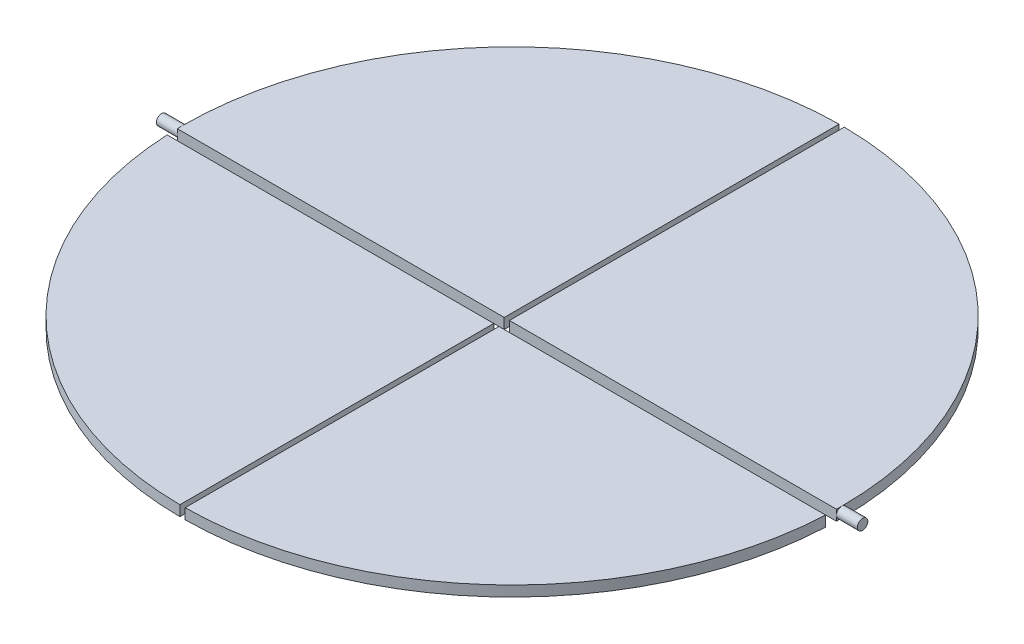
ISO-10303-21;
HEADER;
FILE_DESCRIPTION(('STEP AP214'),'2;1');
FILE_NAME('part.step','',(''),(''),'','','');
FILE_SCHEMA(('AUTOMOTIVE_DESIGN { 1 0 10303 214 1 1 1 1 }'));
ENDSEC;
DATA;
#1=APPLICATION_CONTEXT('core data for automotive mechanical design processes');
#2=APPLICATION_PROTOCOL_DEFINITION('international standard','automotive_design',2000,#1);
#3=PRODUCT_CONTEXT('',#1,'mechanical');
#4=PRODUCT('Part','Part','',(#3));
#5=PRODUCT_RELATED_PRODUCT_CATEGORY('part','',(#4));
#6=PRODUCT_DEFINITION_FORMATION('','',#4);
#7=PRODUCT_DEFINITION_CONTEXT('part definition',#1,'design');
#8=PRODUCT_DEFINITION('design','',#6,#7);
#9=PRODUCT_DEFINITION_SHAPE('','',#8);
#10=(LENGTH_UNIT() NAMED_UNIT(*) SI_UNIT(.MILLI.,.METRE.));
#11=(NAMED_UNIT(*) PLANE_ANGLE_UNIT() SI_UNIT($,.RADIAN.));
#12=(NAMED_UNIT(*) SI_UNIT($,.STERADIAN.) SOLID_ANGLE_UNIT());
#13=UNCERTAINTY_MEASURE_WITH_UNIT(LENGTH_MEASURE(1.E-05),#10,'distance_accuracy_value','');
#14=(GEOMETRIC_REPRESENTATION_CONTEXT(3) GLOBAL_UNCERTAINTY_ASSIGNED_CONTEXT((#13)) GLOBAL_UNIT_ASSIGNED_CONTEXT((#10,
#11,#12)) REPRESENTATION_CONTEXT('',''));
#15=CARTESIAN_POINT('',(0.,0.,0.));
#16=DIRECTION('',(0.,0.,1.));
#17=DIRECTION('',(1.,0.,0.));
#18=AXIS2_PLACEMENT_3D('',#15,#16,#17);
#19=CARTESIAN_POINT('',(0.,0.,0.));
#20=DIRECTION('',(0.,1.,0.));
#21=DIRECTION('',(0.,0.,1.));
#22=AXIS2_PLACEMENT_3D('',#19,#20,#21);
#23=PLANE('',#22);
#24=CARTESIAN_POINT('',(0.,0.,0.));
#25=DIRECTION('',(0.,1.,0.));
#26=DIRECTION('',(0.,0.,1.));
#27=AXIS2_PLACEMENT_3D('',#24,#25,#26);
#28=CIRCLE('',#27,63.);
#29=CARTESIAN_POINT('',(0.500000000000007,0.,62.9980158417708));
#30=VERTEX_POINT('',#29);
#31=CARTESIAN_POINT('',(62.9285308902091,0.,2.99999999999999));
#32=VERTEX_POINT('',#31);
#33=EDGE_CURVE('E105',#30,#32,#28,.T.);
#34=ORIENTED_EDGE('',*,*,#33,.F.);
#35=DIRECTION('',(0.,0.,-1.));
#36=VECTOR('',#35,1.);
#37=CARTESIAN_POINT('',(0.500000000000009,0.,76.0886307398835));
#38=LINE('',#37,#36);
#39=CARTESIAN_POINT('',(0.5,0.,2.99999999999999));
#40=VERTEX_POINT('',#39);
#41=EDGE_CURVE('E75',#30,#40,#38,.T.);
#42=ORIENTED_EDGE('',*,*,#41,.T.);
#43=DIRECTION('',(1.,0.,0.));
#44=VECTOR('',#43,1.);
#45=CARTESIAN_POINT('',(0.,0.,2.99999999999999));
#46=LINE('',#45,#44);
#47=EDGE_CURVE('E98',#40,#32,#46,.T.);
#48=ORIENTED_EDGE('',*,*,#47,.T.);
#49=EDGE_LOOP('',(#34,#42,#48));
#50=FACE_BOUND('',#49,.T.);
#51=ADVANCED_FACE('F56',(#50),#23,.F.);
#52=CARTESIAN_POINT('',(0.,2.,0.));
#53=DIRECTION('',(0.,1.,0.));
#54=DIRECTION('',(0.,0.,1.));
#55=AXIS2_PLACEMENT_3D('',#52,#53,#54);
#56=PLANE('',#55);
#57=DIRECTION('',(0.,0.,-1.));
#58=VECTOR('',#57,1.);
#59=CARTESIAN_POINT('',(0.500000000000009,2.,76.0886307398835));
#60=LINE('',#59,#58);
#61=CARTESIAN_POINT('',(0.500000000000007,2.,62.9980158417708));
#62=VERTEX_POINT('',#61);
#63=CARTESIAN_POINT('',(0.500000000000009,2.,2.99999999999999));
#64=VERTEX_POINT('',#63);
#65=EDGE_CURVE('E12',#62,#64,#60,.T.);
#66=ORIENTED_EDGE('',*,*,#65,.F.);
#67=CARTESIAN_POINT('',(0.,2.,0.));
#68=DIRECTION('',(0.,1.,0.));
#69=DIRECTION('',(0.,0.,1.));
#70=AXIS2_PLACEMENT_3D('',#67,#68,#69);
#71=CIRCLE('',#70,63.);
#72=CARTESIAN_POINT('',(62.9285308902091,2.,2.99999999999999));
#73=VERTEX_POINT('',#72);
#74=EDGE_CURVE('E102',#62,#73,#71,.T.);
#75=ORIENTED_EDGE('',*,*,#74,.T.);
#76=DIRECTION('',(1.,0.,0.));
#77=VECTOR('',#76,1.);
#78=CARTESIAN_POINT('',(0.,2.,2.99999999999999));
#79=LINE('',#78,#77);
#80=EDGE_CURVE('E59',#64,#73,#79,.T.);
#81=ORIENTED_EDGE('',*,*,#80,.F.);
#82=EDGE_LOOP('',(#66,#75,#81));
#83=FACE_BOUND('',#82,.T.);
#84=ADVANCED_FACE('F101',(#83),#56,.T.);
#85=CARTESIAN_POINT('',(0.,2.,0.));
#86=DIRECTION('',(0.,-1.,0.));
#87=DIRECTION('',(0.,0.,-1.));
#88=AXIS2_PLACEMENT_3D('',#85,#86,#87);
#89=CYLINDRICAL_SURFACE('',#88,63.);
#90=ORIENTED_EDGE('',*,*,#74,.F.);
#91=DIRECTION('',(0.,-1.,0.));
#92=VECTOR('',#91,1.);
#93=CARTESIAN_POINT('',(0.500000000000007,2.,62.9980158417708));
#94=LINE('',#93,#92);
#95=EDGE_CURVE('E70',#62,#30,#94,.T.);
#96=ORIENTED_EDGE('',*,*,#95,.T.);
#97=ORIENTED_EDGE('',*,*,#33,.T.);
#98=DIRECTION('',(0.,1.,0.));
#99=VECTOR('',#98,1.);
#100=CARTESIAN_POINT('',(62.9285308902091,0.,2.99999999999999));
#101=LINE('',#100,#99);
#102=EDGE_CURVE('E99',#32,#73,#101,.T.);
#103=ORIENTED_EDGE('',*,*,#102,.T.);
#104=EDGE_LOOP('',(#90,#96,#97,#103));
#105=FACE_BOUND('',#104,.T.);
#106=ADVANCED_FACE('F111',(#105),#89,.T.);
#107=CARTESIAN_POINT('',(0.,0.,2.99999999999999));
#108=DIRECTION('',(0.,0.,1.));
#109=DIRECTION('',(1.,0.,0.));
#110=AXIS2_PLACEMENT_3D('',#107,#108,#109);
#111=PLANE('',#110);
#112=ORIENTED_EDGE('',*,*,#47,.F.);
#113=DIRECTION('',(0.,1.,0.));
#114=VECTOR('',#113,1.);
#115=CARTESIAN_POINT('',(0.5,0.,2.99999999999999));
#116=LINE('',#115,#114);
#117=EDGE_CURVE('E87',#40,#64,#116,.T.);
#118=ORIENTED_EDGE('',*,*,#117,.T.);
#119=ORIENTED_EDGE('',*,*,#80,.T.);
#120=ORIENTED_EDGE('',*,*,#102,.F.);
#121=EDGE_LOOP('',(#112,#118,#119,#120));
#122=FACE_BOUND('',#121,.T.);
#123=ADVANCED_FACE('F94',(#122),#111,.F.);
#124=CARTESIAN_POINT('',(0.500000000000009,0.,76.0886307398835));
#125=DIRECTION('',(1.,0.,0.));
#126=DIRECTION('',(0.,0.,-1.));
#127=AXIS2_PLACEMENT_3D('',#124,#125,#126);
#128=PLANE('',#127);
#129=ORIENTED_EDGE('',*,*,#65,.T.);
#130=ORIENTED_EDGE('',*,*,#117,.F.);
#131=ORIENTED_EDGE('',*,*,#41,.F.);
#132=ORIENTED_EDGE('',*,*,#95,.F.);
#133=EDGE_LOOP('',(#129,#130,#131,#132));
#134=FACE_BOUND('',#133,.T.);
#135=ADVANCED_FACE('F86',(#134),#128,.F.);
#136=CLOSED_SHELL('',(#51,#84,#106,#123,#135));
#137=MANIFOLD_SOLID_BREP('B2',#136);
#138=CARTESIAN_POINT('',(0.,2.,0.));
#139=DIRECTION('',(0.,-1.,0.));
#140=DIRECTION('',(0.,0.,-1.));
#141=AXIS2_PLACEMENT_3D('',#138,#139,#140);
#142=CYLINDRICAL_SURFACE('',#141,63.);
#143=CARTESIAN_POINT('',(0.,0.,0.));
#144=DIRECTION('',(0.,1.,0.));
#145=DIRECTION('',(0.,0.,1.));
#146=AXIS2_PLACEMENT_3D('',#143,#144,#145);
#147=CIRCLE('',#146,63.);
#148=CARTESIAN_POINT('',(63.,0.,0.));
#149=VERTEX_POINT('',#148);
#150=CARTESIAN_POINT('',(0.5,0.,-62.9980158417707));
#151=VERTEX_POINT('',#150);
#152=EDGE_CURVE('E168',#149,#151,#147,.T.);
#153=ORIENTED_EDGE('',*,*,#152,.T.);
#154=DIRECTION('',(0.,-1.,0.));
#155=VECTOR('',#154,1.);
#156=CARTESIAN_POINT('',(0.5,2.,-62.9980158417708));
#157=LINE('',#156,#155);
#158=CARTESIAN_POINT('',(0.5,2.,-62.9980158417707));
#159=VERTEX_POINT('',#158);
#160=EDGE_CURVE('E183',#151,#159,#157,.F.);
#161=ORIENTED_EDGE('',*,*,#160,.T.);
#162=CARTESIAN_POINT('',(0.,2.,0.));
#163=DIRECTION('',(0.,1.,0.));
#164=DIRECTION('',(0.,0.,1.));
#165=AXIS2_PLACEMENT_3D('',#162,#163,#164);
#166=CIRCLE('',#165,63.);
#167=CARTESIAN_POINT('',(63.,2.,0.));
#168=VERTEX_POINT('',#167);
#169=EDGE_CURVE('E220',#168,#159,#166,.T.);
#170=ORIENTED_EDGE('',*,*,#169,.F.);
#171=CARTESIAN_POINT('',(63.,2.,0.));
#172=CARTESIAN_POINT('',(62.9999998927801,1.99999751044008,-0.0561666432225347));
#173=CARTESIAN_POINT('',(62.9999240819839,1.99525208264565,-0.112373922502886));
#174=CARTESIAN_POINT('',(62.999628945612,1.97638762701122,-0.22324024292529));
#175=CARTESIAN_POINT('',(62.9994094476661,1.96225734060228,-0.277897342171853));
#176=CARTESIAN_POINT('',(62.9988518002486,1.92502575940682,-0.384041100981931));
#177=CARTESIAN_POINT('',(62.9985137078414,1.90192877858822,-0.435529271369662));
#178=CARTESIAN_POINT('',(62.9977570314289,1.84742544657334,-0.533882815848443));
#179=CARTESIAN_POINT('',(62.9973384673431,1.81602115099488,-0.580749329620264));
#180=CARTESIAN_POINT('',(62.9964678868612,1.74578537332572,-0.668554628843129));
#181=CARTESIAN_POINT('',(62.9960158643467,1.70695253072046,-0.709492326033491));
#182=CARTESIAN_POINT('',(62.9951293686052,1.62296367209696,-0.784268998105302));
#183=CARTESIAN_POINT('',(62.9946948960708,1.57780740690147,-0.81810769311612));
#184=CARTESIAN_POINT('',(62.9938924898058,1.48245269722975,-0.877724996623669));
#185=CARTESIAN_POINT('',(62.9935245583476,1.43225408064874,-0.903503329881728));
#186=CARTESIAN_POINT('',(62.9928967443497,1.32824092731131,-0.946266207889913));
#187=CARTESIAN_POINT('',(62.9926368615323,1.27442639984849,-0.963250775240731));
#188=CARTESIAN_POINT('',(62.9922544709765,1.16471374219309,-0.987942689198417));
#189=CARTESIAN_POINT('',(62.9921319517658,1.10881578640643,-0.995650810555873));
#190=CARTESIAN_POINT('',(62.9920380675559,0.99651916667162,-1.00157340010755));
#191=CARTESIAN_POINT('',(62.9920667021917,0.9401205039329,-0.999787891227032));
#192=CARTESIAN_POINT('',(62.9922718858726,0.828428698091347,-0.986774599142015));
#193=CARTESIAN_POINT('',(62.9924484216319,0.773135456145996,-0.975547664054824));
#194=CARTESIAN_POINT('',(62.9929294843787,0.665218644820116,-0.943971516390759));
#195=CARTESIAN_POINT('',(62.9932340115425,0.612595079115556,-0.923622291253469));
#196=CARTESIAN_POINT('',(62.9939367404442,0.511508756651117,-0.874378239749819));
#197=CARTESIAN_POINT('',(62.9943349464438,0.463046189321602,-0.845483024591268));
#198=CARTESIAN_POINT('',(62.9951801350739,0.371659653486664,-0.779967536703924));
#199=CARTESIAN_POINT('',(62.9956271177213,0.328735686911454,-0.743347261282944));
#200=CARTESIAN_POINT('',(62.9965195268522,0.249639851923911,-0.663416361880623));
#201=CARTESIAN_POINT('',(62.9969649531583,0.213468729796305,-0.62010499940508));
#202=CARTESIAN_POINT('',(62.9978039850519,0.148911109301982,-0.528024004064598));
#203=CARTESIAN_POINT('',(62.9981975906323,0.120524612012234,-0.479254370444533));
#204=CARTESIAN_POINT('',(62.9988886081472,0.0723421381491057,-0.377640849128776));
#205=CARTESIAN_POINT('',(62.9991860198336,0.052546183729908,-0.324796950926362));
#206=CARTESIAN_POINT('',(62.9996511158661,0.0221072115742371,-0.216535157659641));
#207=CARTESIAN_POINT('',(62.9998188003152,0.0114641865677128,-0.161117264639862));
#208=CARTESIAN_POINT('',(63.0000055249692,-0.000365894132838789,-0.0492871024294313));
#209=CARTESIAN_POINT('',(63.0000245813948,-0.00155398170724248,0.00712505757673893));
#210=CARTESIAN_POINT('',(62.9999119445625,0.00555685114072476,0.119348080955619));
#211=CARTESIAN_POINT('',(62.9997802513486,0.0138557687961803,0.175158944503695));
#212=CARTESIAN_POINT('',(62.9993809715643,0.0397041787547584,0.284592208001385));
#213=CARTESIAN_POINT('',(62.999113391857,0.0572532038804057,0.33821471832662));
#214=CARTESIAN_POINT('',(62.9984725023587,0.101103190659322,0.44175248000115));
#215=CARTESIAN_POINT('',(62.9980991925181,0.127404156427928,0.491667729607203));
#216=CARTESIAN_POINT('',(62.997288880645,0.188014083501718,0.58637878778528));
#217=CARTESIAN_POINT('',(62.9968518730875,0.222323739632951,0.631174151658477));
#218=CARTESIAN_POINT('',(62.995963448209,0.297976093393741,0.714369387532707));
#219=CARTESIAN_POINT('',(62.9955120308736,0.339318798093904,0.752769253104013));
#220=CARTESIAN_POINT('',(62.9946456331274,0.42786807771191,0.822086867574606));
#221=CARTESIAN_POINT('',(62.9942306559657,0.475075174603494,0.853003949728408));
#222=CARTESIAN_POINT('',(62.9934839757407,0.574010467206131,0.906473780561848));
#223=CARTESIAN_POINT('',(62.9931522725616,0.625738656624403,0.929026540883322));
#224=CARTESIAN_POINT('',(62.9926095606234,0.732245231245425,0.965126386356914));
#225=CARTESIAN_POINT('',(62.9923985460315,0.787023468900533,0.978673906732622));
#226=CARTESIAN_POINT('',(62.9921209851839,0.898077330864654,0.996380141563631));
#227=CARTESIAN_POINT('',(62.9920544390802,0.954352956749301,1.0005388461391));
#228=CARTESIAN_POINT('',(62.9920733204648,1.06679730027058,0.999349317400655));
#229=CARTESIAN_POINT('',(62.992158730975,1.1229660291488,0.994002146168894));
#230=CARTESIAN_POINT('',(62.9924718610481,1.23360851341797,0.973954813622973));
#231=CARTESIAN_POINT('',(62.9926995808961,1.28808226541207,0.959254633565973));
#232=CARTESIAN_POINT('',(62.993271658362,1.39378949618629,0.920918470362608));
#233=CARTESIAN_POINT('',(62.9936160181177,1.44502291555617,0.897282323434151));
#234=CARTESIAN_POINT('',(62.9943825356015,1.54279263722827,0.841746265659636));
#235=CARTESIAN_POINT('',(62.9948046903424,1.58932911978353,0.809846672105262));
#236=CARTESIAN_POINT('',(62.9956792265095,1.67638712114475,0.738688893341088));
#237=CARTESIAN_POINT('',(62.9961316080961,1.7169086080276,0.699430669079672));
#238=CARTESIAN_POINT('',(62.9970157191694,1.79079608183503,0.614657063190975));
#239=CARTESIAN_POINT('',(62.9974474435007,1.82416028965812,0.569140130425279));
#240=CARTESIAN_POINT('',(62.9982416571192,1.88278784761654,0.473130496152272));
#241=CARTESIAN_POINT('',(62.9986041099354,1.90804693517234,0.422635194649554));
#242=CARTESIAN_POINT('',(62.9992181858523,1.94969988986234,0.318159477863941));
#243=CARTESIAN_POINT('',(62.9994699415537,1.96610436904772,0.264183321592263));
#244=CARTESIAN_POINT('',(62.9997666899057,1.98521722752854,0.174886679296475));
#245=CARTESIAN_POINT('',(62.999853803534,1.99075383288731,0.140146252669038));
#246=CARTESIAN_POINT('',(62.9999704921249,1.99814599788615,0.0702758544141254));
#247=CARTESIAN_POINT('',(63.0000000670921,2.00000155782465,0.0351458828182307));
#248=CARTESIAN_POINT('',(63.,2.,0.));
#249=B_SPLINE_CURVE_WITH_KNOTS('',3,(#171,#172,#173,#174,#175,#176,#177,#178,#179,#180,#181,
#182,#183,#184,#185,#186,#187,#188,#189,#190,#191,#192,#193,#194,#195,#196,#197,#198,#199,#200,
#201,#202,#203,#204,#205,#206,#207,#208,#209,#210,#211,#212,#213,#214,#215,#216,#217,#218,#219,
#220,#221,#222,#223,#224,#225,#226,#227,#228,#229,#230,#231,#232,#233,#234,#235,#236,#237,#238,
#239,#240,#241,#242,#243,#244,#245,#246,#247,#248),.UNSPECIFIED.,.T.,.F.,(4,2,2,2,2,2,2,2,2,2,2,
2,2,2,2,2,2,2,2,2,2,2,2,2,2,2,2,2,2,2,2,2,2,2,2,2,2,2,4),(0.,0.168371645991673,
0.336945645169948,0.505438641990063,0.673889984707769,0.84237220833707,1.01086107295162,
1.1793556903586,1.34784987471857,1.51632998579769,1.68480969003047,1.85327426145504,
2.02173906483797,2.19021153355603,2.35868406098691,2.52717519600528,2.69566635433365,
2.86415794718192,3.03264940619942,3.20112247636811,3.36959549740112,3.53806001050483,
3.70652460282403,3.8750038164005,4.04348319935687,4.21197758896782,4.38047174405992,
4.5489577552309,4.71744394369924,4.8859113085545,5.0543790110088,5.22284980135843,
5.39131412389121,5.55977934047492,5.72828638445005,5.89688190359658,6.06527491357461,
6.17063229796083,6.27598967380564),.UNSPECIFIED.);
#250=EDGE_CURVE('E234',#168,#149,#249,.T.);
#251=ORIENTED_EDGE('',*,*,#250,.T.);
#252=EDGE_LOOP('',(#153,#161,#170,#251));
#253=FACE_BOUND('',#252,.T.);
#254=ADVANCED_FACE('F164',(#253),#142,.T.);
#255=CARTESIAN_POINT('',(0.,2.,0.));
#256=DIRECTION('',(0.,1.,0.));
#257=DIRECTION('',(0.,0.,1.));
#258=AXIS2_PLACEMENT_3D('',#255,#256,#257);
#259=PLANE('',#258);
#260=DIRECTION('',(0.,0.,-1.));
#261=VECTOR('',#260,1.);
#262=CARTESIAN_POINT('',(0.5,2.,2.02511387558862));
#263=LINE('',#262,#261);
#264=CARTESIAN_POINT('',(0.5,2.,0.999999999999994));
#265=VERTEX_POINT('',#264);
#266=EDGE_CURVE('E54',#265,#159,#263,.T.);
#267=ORIENTED_EDGE('',*,*,#266,.F.);
#268=DIRECTION('',(-1.,0.,0.));
#269=VECTOR('',#268,1.);
#270=CARTESIAN_POINT('',(0.,2.,0.999999999999993));
#271=LINE('',#270,#269);
#272=CARTESIAN_POINT('',(62.9920629920945,2.,0.999999999999993));
#273=VERTEX_POINT('',#272);
#274=EDGE_CURVE('E213',#273,#265,#271,.T.);
#275=ORIENTED_EDGE('',*,*,#274,.F.);
#276=EDGE_CURVE('E232',#273,#168,#166,.T.);
#277=ORIENTED_EDGE('',*,*,#276,.T.);
#278=ORIENTED_EDGE('',*,*,#169,.T.);
#279=EDGE_LOOP('',(#267,#275,#277,#278));
#280=FACE_BOUND('',#279,.T.);
#281=ADVANCED_FACE('F166',(#280),#259,.T.);
#282=CARTESIAN_POINT('',(0.,0.,0.));
#283=DIRECTION('',(0.,1.,0.));
#284=DIRECTION('',(0.,0.,1.));
#285=AXIS2_PLACEMENT_3D('',#282,#283,#284);
#286=PLANE('',#285);
#287=DIRECTION('',(-1.,0.,0.));
#288=VECTOR('',#287,1.);
#289=CARTESIAN_POINT('',(0.,0.,0.999999999999993));
#290=LINE('',#289,#288);
#291=CARTESIAN_POINT('',(62.9920629920945,0.,0.999999999999993));
#292=VERTEX_POINT('',#291);
#293=CARTESIAN_POINT('',(0.5,0.,0.999999999999993));
#294=VERTEX_POINT('',#293);
#295=EDGE_CURVE('E227',#292,#294,#290,.T.);
#296=ORIENTED_EDGE('',*,*,#295,.T.);
#297=DIRECTION('',(0.,0.,-1.));
#298=VECTOR('',#297,1.);
#299=CARTESIAN_POINT('',(0.5,0.,2.02511387558862));
#300=LINE('',#299,#298);
#301=EDGE_CURVE('E203',#294,#151,#300,.T.);
#302=ORIENTED_EDGE('',*,*,#301,.T.);
#303=ORIENTED_EDGE('',*,*,#152,.F.);
#304=EDGE_CURVE('E255',#292,#149,#147,.T.);
#305=ORIENTED_EDGE('',*,*,#304,.F.);
#306=EDGE_LOOP('',(#296,#302,#303,#305));
#307=FACE_BOUND('',#306,.T.);
#308=ADVANCED_FACE('F273',(#307),#286,.F.);
#309=CARTESIAN_POINT('',(0.,0.,0.999999999999993));
#310=DIRECTION('',(0.,0.,-1.));
#311=DIRECTION('',(-1.,0.,0.));
#312=AXIS2_PLACEMENT_3D('',#309,#310,#311);
#313=PLANE('',#312);
#314=ORIENTED_EDGE('',*,*,#274,.T.);
#315=DIRECTION('',(0.,-1.,0.));
#316=VECTOR('',#315,1.);
#317=CARTESIAN_POINT('',(0.5,0.,0.999999999999993));
#318=LINE('',#317,#316);
#319=EDGE_CURVE('E205',#265,#294,#318,.T.);
#320=ORIENTED_EDGE('',*,*,#319,.T.);
#321=ORIENTED_EDGE('',*,*,#295,.F.);
#322=DIRECTION('',(0.,1.,0.));
#323=VECTOR('',#322,1.);
#324=CARTESIAN_POINT('',(62.9920629920945,0.,0.999999999999993));
#325=LINE('',#324,#323);
#326=CARTESIAN_POINT('',(62.9920629920945,1.,0.999999999999993));
#327=VERTEX_POINT('',#326);
#328=EDGE_CURVE('E212',#292,#327,#325,.T.);
#329=ORIENTED_EDGE('',*,*,#328,.T.);
#330=EDGE_CURVE('E223',#327,#273,#325,.T.);
#331=ORIENTED_EDGE('',*,*,#330,.T.);
#332=EDGE_LOOP('',(#314,#320,#321,#329,#331));
#333=FACE_BOUND('',#332,.T.);
#334=ADVANCED_FACE('F221',(#333),#313,.F.);
#335=ORIENTED_EDGE('',*,*,#276,.F.);
#336=ORIENTED_EDGE('',*,*,#330,.F.);
#337=EDGE_CURVE('E240',#327,#168,#249,.T.);
#338=ORIENTED_EDGE('',*,*,#337,.T.);
#339=EDGE_LOOP('',(#335,#336,#338));
#340=FACE_BOUND('',#339,.T.);
#341=ADVANCED_FACE('F285',(#340),#142,.T.);
#342=EDGE_CURVE('E239',#149,#327,#249,.T.);
#343=ORIENTED_EDGE('',*,*,#342,.T.);
#344=ORIENTED_EDGE('',*,*,#328,.F.);
#345=ORIENTED_EDGE('',*,*,#304,.T.);
#346=EDGE_LOOP('',(#343,#344,#345));
#347=FACE_BOUND('',#346,.T.);
#348=ADVANCED_FACE('F274',(#347),#142,.T.);
#349=CARTESIAN_POINT('',(-67.,1.,0.));
#350=DIRECTION('',(1.,0.,0.));
#351=DIRECTION('',(0.,0.,-1.));
#352=AXIS2_PLACEMENT_3D('',#349,#350,#351);
#353=CYLINDRICAL_SURFACE('',#352,1.);
#354=CARTESIAN_POINT('',(67.,1.,0.));
#355=DIRECTION('',(1.,0.,0.));
#356=DIRECTION('',(0.,0.,-1.));
#357=AXIS2_PLACEMENT_3D('',#354,#355,#356);
#358=CIRCLE('',#357,1.);
#359=CARTESIAN_POINT('',(67.,1.,-1.00000000000001));
#360=VERTEX_POINT('',#359);
#361=EDGE_CURVE('E175',#360,#360,#358,.T.);
#362=ORIENTED_EDGE('',*,*,#361,.F.);
#363=EDGE_LOOP('',(#362));
#364=FACE_BOUND('',#363,.T.);
#365=ORIENTED_EDGE('',*,*,#250,.F.);
#366=ORIENTED_EDGE('',*,*,#337,.F.);
#367=ORIENTED_EDGE('',*,*,#342,.F.);
#368=EDGE_LOOP('',(#365,#366,#367));
#369=FACE_BOUND('',#368,.T.);
#370=ADVANCED_FACE('F276',(#364,#369),#353,.T.);
#371=CARTESIAN_POINT('',(67.,1.,0.));
#372=DIRECTION('',(1.,0.,0.));
#373=DIRECTION('',(0.,0.,-1.));
#374=AXIS2_PLACEMENT_3D('',#371,#372,#373);
#375=PLANE('',#374);
#376=ORIENTED_EDGE('',*,*,#361,.T.);
#377=EDGE_LOOP('',(#376));
#378=FACE_BOUND('',#377,.T.);
#379=ADVANCED_FACE('F278',(#378),#375,.T.);
#380=CARTESIAN_POINT('',(0.5,0.,2.02511387558862));
#381=DIRECTION('',(1.,0.,0.));
#382=DIRECTION('',(0.,0.,-1.));
#383=AXIS2_PLACEMENT_3D('',#380,#381,#382);
#384=PLANE('',#383);
#385=ORIENTED_EDGE('',*,*,#301,.F.);
#386=ORIENTED_EDGE('',*,*,#319,.F.);
#387=ORIENTED_EDGE('',*,*,#266,.T.);
#388=ORIENTED_EDGE('',*,*,#160,.F.);
#389=EDGE_LOOP('',(#385,#386,#387,#388));
#390=FACE_BOUND('',#389,.T.);
#391=ADVANCED_FACE('F207',(#390),#384,.F.);
#392=CLOSED_SHELL('',(#254,#281,#308,#334,#341,#348,#370,#379,#391));
#393=MANIFOLD_SOLID_BREP('B6',#392);
#394=CARTESIAN_POINT('',(-67.,1.,0.));
#395=DIRECTION('',(1.,0.,0.));
#396=DIRECTION('',(0.,0.,-1.));
#397=AXIS2_PLACEMENT_3D('',#394,#395,#396);
#398=PLANE('',#397);
#399=CARTESIAN_POINT('',(-67.,1.,0.));
#400=DIRECTION('',(1.,0.,0.));
#401=DIRECTION('',(0.,0.,-1.));
#402=AXIS2_PLACEMENT_3D('',#399,#400,#401);
#403=CIRCLE('',#402,1.);
#404=CARTESIAN_POINT('',(-67.,1.,-1.00000000000001));
#405=VERTEX_POINT('',#404);
#406=EDGE_CURVE('E407',#405,#405,#403,.T.);
#407=ORIENTED_EDGE('',*,*,#406,.F.);
#408=EDGE_LOOP('',(#407));
#409=FACE_BOUND('',#408,.T.);
#410=ADVANCED_FACE('F360',(#409),#398,.F.);
#411=CARTESIAN_POINT('',(-67.,1.,0.));
#412=DIRECTION('',(1.,0.,0.));
#413=DIRECTION('',(0.,0.,-1.));
#414=AXIS2_PLACEMENT_3D('',#411,#412,#413);
#415=CYLINDRICAL_SURFACE('',#414,1.);
#416=ORIENTED_EDGE('',*,*,#406,.T.);
#417=EDGE_LOOP('',(#416));
#418=FACE_BOUND('',#417,.T.);
#419=CARTESIAN_POINT('',(-63.,2.,0.));
#420=CARTESIAN_POINT('',(-62.9999998927801,1.99999751044008,0.0561666432225208));
#421=CARTESIAN_POINT('',(-62.9999240819839,1.99525208264565,0.112373922502872));
#422=CARTESIAN_POINT('',(-62.999628945612,1.97638762701122,0.223240242925276));
#423=CARTESIAN_POINT('',(-62.9994094476661,1.96225734060228,0.277897342171839));
#424=CARTESIAN_POINT('',(-62.9988518002486,1.92502575940682,0.384041100981917));
#425=CARTESIAN_POINT('',(-62.9985137078414,1.90192877858822,0.435529271369648));
#426=CARTESIAN_POINT('',(-62.9977570314289,1.84742544657334,0.533882815848429));
#427=CARTESIAN_POINT('',(-62.9973384673431,1.81602115099488,0.58074932962025));
#428=CARTESIAN_POINT('',(-62.9964678868612,1.74578537332572,0.668554628843116));
#429=CARTESIAN_POINT('',(-62.9960158643467,1.70695253072046,0.709492326033477));
#430=CARTESIAN_POINT('',(-62.9951293686052,1.62296367209696,0.784268998105288));
#431=CARTESIAN_POINT('',(-62.9946948960708,1.57780740690147,0.818107693116106));
#432=CARTESIAN_POINT('',(-62.9938924898058,1.48245269722975,0.877724996623655));
#433=CARTESIAN_POINT('',(-62.9935245583476,1.43225408064874,0.903503329881714));
#434=CARTESIAN_POINT('',(-62.9928967443497,1.32824092731131,0.946266207889899));
#435=CARTESIAN_POINT('',(-62.9926368615323,1.27442639984849,0.963250775240718));
#436=CARTESIAN_POINT('',(-62.9922544709765,1.16471374219309,0.987942689198404));
#437=CARTESIAN_POINT('',(-62.9921319517658,1.10881578640643,0.995650810555859));
#438=CARTESIAN_POINT('',(-62.9920380675559,0.99651916667162,1.00157340010754));
#439=CARTESIAN_POINT('',(-62.9920667021917,0.9401205039329,0.999787891227018));
#440=CARTESIAN_POINT('',(-62.9922718858726,0.828428698091347,0.986774599142001));
#441=CARTESIAN_POINT('',(-62.9924484216319,0.773135456145996,0.97554766405481));
#442=CARTESIAN_POINT('',(-62.9929294843787,0.665218644820116,0.943971516390745));
#443=CARTESIAN_POINT('',(-62.9932340115425,0.612595079115556,0.923622291253455));
#444=CARTESIAN_POINT('',(-62.9939367404442,0.511508756651117,0.874378239749805));
#445=CARTESIAN_POINT('',(-62.9943349464438,0.463046189321602,0.845483024591255));
#446=CARTESIAN_POINT('',(-62.9951801350739,0.371659653486664,0.77996753670391));
#447=CARTESIAN_POINT('',(-62.9956271177213,0.328735686911454,0.74334726128293));
#448=CARTESIAN_POINT('',(-62.9965195268522,0.249639851923911,0.663416361880609));
#449=CARTESIAN_POINT('',(-62.9969649531583,0.213468729796305,0.620104999405066));
#450=CARTESIAN_POINT('',(-62.9978039850519,0.148911109301982,0.528024004064585));
#451=CARTESIAN_POINT('',(-62.9981975906323,0.120524612012234,0.47925437044452));
#452=CARTESIAN_POINT('',(-62.9988886081472,0.0723421381491057,0.377640849128762));
#453=CARTESIAN_POINT('',(-62.9991860198336,0.0525461837299081,0.324796950926348));
#454=CARTESIAN_POINT('',(-62.9996511158661,0.0221072115742373,0.216535157659627));
#455=CARTESIAN_POINT('',(-62.9998188003152,0.011464186567713,0.161117264639848));
#456=CARTESIAN_POINT('',(-63.0000055249692,-0.000365894132838635,0.0492871024294174));
#457=CARTESIAN_POINT('',(-63.0000245813948,-0.00155398170724252,-0.00712505757675283));
#458=CARTESIAN_POINT('',(-62.9999119445625,0.00555685114072462,-0.119348080955633));
#459=CARTESIAN_POINT('',(-62.9997802513486,0.0138557687961802,-0.175158944503709));
#460=CARTESIAN_POINT('',(-62.9993809715643,0.0397041787547584,-0.284592208001399));
#461=CARTESIAN_POINT('',(-62.999113391857,0.0572532038804056,-0.338214718326634));
#462=CARTESIAN_POINT('',(-62.9984725023587,0.101103190659322,-0.441752480001164));
#463=CARTESIAN_POINT('',(-62.9980991925181,0.127404156427928,-0.491667729607217));
#464=CARTESIAN_POINT('',(-62.997288880645,0.188014083501718,-0.586378787785294));
#465=CARTESIAN_POINT('',(-62.9968518730875,0.222323739632951,-0.631174151658491));
#466=CARTESIAN_POINT('',(-62.995963448209,0.297976093393741,-0.714369387532721));
#467=CARTESIAN_POINT('',(-62.9955120308736,0.339318798093903,-0.752769253104027));
#468=CARTESIAN_POINT('',(-62.9946456331274,0.42786807771191,-0.82208686757462));
#469=CARTESIAN_POINT('',(-62.9942306559657,0.475075174603494,-0.853003949728422));
#470=CARTESIAN_POINT('',(-62.9934839757407,0.574010467206131,-0.906473780561862));
#471=CARTESIAN_POINT('',(-62.9931522725616,0.625738656624403,-0.929026540883336));
#472=CARTESIAN_POINT('',(-62.9926095606234,0.732245231245425,-0.965126386356928));
#473=CARTESIAN_POINT('',(-62.9923985460315,0.787023468900533,-0.978673906732635));
#474=CARTESIAN_POINT('',(-62.9921209851839,0.898077330864653,-0.996380141563645));
#475=CARTESIAN_POINT('',(-62.9920544390802,0.954352956749301,-1.00053884613912));
#476=CARTESIAN_POINT('',(-62.9920733204648,1.06679730027058,-0.999349317400669));
#477=CARTESIAN_POINT('',(-62.992158730975,1.1229660291488,-0.994002146168907));
#478=CARTESIAN_POINT('',(-62.9924718610481,1.23360851341797,-0.973954813622987));
#479=CARTESIAN_POINT('',(-62.9926995808961,1.28808226541207,-0.959254633565987));
#480=CARTESIAN_POINT('',(-62.993271658362,1.39378949618629,-0.920918470362622));
#481=CARTESIAN_POINT('',(-62.9936160181177,1.44502291555617,-0.897282323434165));
#482=CARTESIAN_POINT('',(-62.9943825356015,1.54279263722827,-0.84174626565965));
#483=CARTESIAN_POINT('',(-62.9948046903424,1.58932911978353,-0.809846672105275));
#484=CARTESIAN_POINT('',(-62.9956792265095,1.67638712114475,-0.738688893341102));
#485=CARTESIAN_POINT('',(-62.9961316080961,1.7169086080276,-0.699430669079686));
#486=CARTESIAN_POINT('',(-62.9970157191694,1.79079608183503,-0.614657063190989));
#487=CARTESIAN_POINT('',(-62.9974474435007,1.82416028965812,-0.569140130425293));
#488=CARTESIAN_POINT('',(-62.9982416571192,1.88278784761654,-0.473130496152286));
#489=CARTESIAN_POINT('',(-62.9986041099354,1.90804693517234,-0.422635194649568));
#490=CARTESIAN_POINT('',(-62.9992181858523,1.94969988986234,-0.318159477863955));
#491=CARTESIAN_POINT('',(-62.9994699415537,1.96610436904772,-0.264183321592278));
#492=CARTESIAN_POINT('',(-62.9997666899057,1.98521722752854,-0.174886679296489));
#493=CARTESIAN_POINT('',(-62.999853803534,1.99075383288731,-0.140146252669052));
#494=CARTESIAN_POINT('',(-62.9999704921249,1.99814599788615,-0.0702758544141393));
#495=CARTESIAN_POINT('',(-63.0000000670921,2.00000155782465,-0.0351458828182446));
#496=CARTESIAN_POINT('',(-63.,2.,0.));
#497=B_SPLINE_CURVE_WITH_KNOTS('',3,(#419,#420,#421,#422,#423,#424,#425,#426,#427,#428,#429,
#430,#431,#432,#433,#434,#435,#436,#437,#438,#439,#440,#441,#442,#443,#444,#445,#446,#447,#448,
#449,#450,#451,#452,#453,#454,#455,#456,#457,#458,#459,#460,#461,#462,#463,#464,#465,#466,#467,
#468,#469,#470,#471,#472,#473,#474,#475,#476,#477,#478,#479,#480,#481,#482,#483,#484,#485,#486,
#487,#488,#489,#490,#491,#492,#493,#494,#495,#496),.UNSPECIFIED.,.T.,.F.,(4,2,2,2,2,2,2,2,2,2,2,
2,2,2,2,2,2,2,2,2,2,2,2,2,2,2,2,2,2,2,2,2,2,2,2,2,2,2,4),(0.,0.168371645991673,
0.336945645169948,0.505438641990063,0.673889984707769,0.84237220833707,1.01086107295162,
1.1793556903586,1.34784987471857,1.51632998579769,1.68480969003047,1.85327426145504,
2.02173906483797,2.19021153355603,2.35868406098691,2.52717519600528,2.69566635433365,
2.86415794718192,3.03264940619942,3.20112247636811,3.36959549740112,3.53806001050483,
3.70652460282403,3.8750038164005,4.04348319935687,4.21197758896782,4.38047174405992,
4.5489577552309,4.71744394369924,4.8859113085545,5.0543790110088,5.22284980135843,
5.39131412389121,5.55977934047492,5.72828638445005,5.89688190359658,6.06527491357461,
6.17063229796084,6.27598967380564),.UNSPECIFIED.);
#498=CARTESIAN_POINT('',(-63.,2.,0.));
#499=VERTEX_POINT('',#498);
#500=CARTESIAN_POINT('',(-62.9920629920945,1.,0.999999999999993));
#501=VERTEX_POINT('',#500);
#502=EDGE_CURVE('E414',#499,#501,#497,.T.);
#503=ORIENTED_EDGE('',*,*,#502,.F.);
#504=CARTESIAN_POINT('',(-63.,0.,0.));
#505=VERTEX_POINT('',#504);
#506=EDGE_CURVE('E423',#505,#499,#497,.T.);
#507=ORIENTED_EDGE('',*,*,#506,.F.);
#508=EDGE_CURVE('E424',#501,#505,#497,.T.);
#509=ORIENTED_EDGE('',*,*,#508,.F.);
#510=EDGE_LOOP('',(#503,#507,#509));
#511=FACE_BOUND('',#510,.T.);
#512=ADVANCED_FACE('F445',(#418,#511),#415,.T.);
#513=CARTESIAN_POINT('',(0.,2.,0.));
#514=DIRECTION('',(0.,-1.,0.));
#515=DIRECTION('',(0.,0.,-1.));
#516=AXIS2_PLACEMENT_3D('',#513,#514,#515);
#517=CYLINDRICAL_SURFACE('',#516,63.);
#518=CARTESIAN_POINT('',(0.,0.,0.));
#519=DIRECTION('',(0.,1.,0.));
#520=DIRECTION('',(0.,0.,1.));
#521=AXIS2_PLACEMENT_3D('',#518,#519,#520);
#522=CIRCLE('',#521,63.);
#523=CARTESIAN_POINT('',(-62.9920629920945,0.,0.999999999999993));
#524=VERTEX_POINT('',#523);
#525=EDGE_CURVE('E425',#505,#524,#522,.T.);
#526=ORIENTED_EDGE('',*,*,#525,.T.);
#527=DIRECTION('',(0.,1.,0.));
#528=VECTOR('',#527,1.);
#529=CARTESIAN_POINT('',(-62.9920629920945,0.,0.999999999999993));
#530=LINE('',#529,#528);
#531=EDGE_CURVE('E417',#524,#501,#530,.T.);
#532=ORIENTED_EDGE('',*,*,#531,.T.);
#533=ORIENTED_EDGE('',*,*,#508,.T.);
#534=EDGE_LOOP('',(#526,#532,#533));
#535=FACE_BOUND('',#534,.T.);
#536=ADVANCED_FACE('F450',(#535),#517,.T.);
#537=ORIENTED_EDGE('',*,*,#502,.T.);
#538=CARTESIAN_POINT('',(-62.9920629920945,2.,0.999999999999993));
#539=VERTEX_POINT('',#538);
#540=EDGE_CURVE('E403',#501,#539,#530,.T.);
#541=ORIENTED_EDGE('',*,*,#540,.T.);
#542=CARTESIAN_POINT('',(0.,2.,0.));
#543=DIRECTION('',(0.,1.,0.));
#544=DIRECTION('',(0.,0.,1.));
#545=AXIS2_PLACEMENT_3D('',#542,#543,#544);
#546=CIRCLE('',#545,63.);
#547=EDGE_CURVE('E412',#499,#539,#546,.T.);
#548=ORIENTED_EDGE('',*,*,#547,.F.);
#549=EDGE_LOOP('',(#537,#541,#548));
#550=FACE_BOUND('',#549,.T.);
#551=ADVANCED_FACE('F362',(#550),#517,.T.);
#552=CARTESIAN_POINT('',(0.,0.,0.999999999999993));
#553=DIRECTION('',(0.,0.,-1.));
#554=DIRECTION('',(-1.,0.,0.));
#555=AXIS2_PLACEMENT_3D('',#552,#553,#554);
#556=PLANE('',#555);
#557=DIRECTION('',(-1.,0.,0.));
#558=VECTOR('',#557,1.);
#559=CARTESIAN_POINT('',(0.,0.,0.999999999999993));
#560=LINE('',#559,#558);
#561=CARTESIAN_POINT('',(-0.5,0.,0.999999999999959));
#562=VERTEX_POINT('',#561);
#563=EDGE_CURVE('E384',#562,#524,#560,.T.);
#564=ORIENTED_EDGE('',*,*,#563,.F.);
#565=DIRECTION('',(0.,1.,0.));
#566=VECTOR('',#565,1.);
#567=CARTESIAN_POINT('',(-0.5,0.,0.999999999999993));
#568=LINE('',#567,#566);
#569=CARTESIAN_POINT('',(-0.5,2.,0.999999999999993));
#570=VERTEX_POINT('',#569);
#571=EDGE_CURVE('E162',#562,#570,#568,.T.);
#572=ORIENTED_EDGE('',*,*,#571,.T.);
#573=DIRECTION('',(-1.,0.,0.));
#574=VECTOR('',#573,1.);
#575=CARTESIAN_POINT('',(0.,2.,0.999999999999993));
#576=LINE('',#575,#574);
#577=EDGE_CURVE('E369',#570,#539,#576,.T.);
#578=ORIENTED_EDGE('',*,*,#577,.T.);
#579=ORIENTED_EDGE('',*,*,#540,.F.);
#580=ORIENTED_EDGE('',*,*,#531,.F.);
#581=EDGE_LOOP('',(#564,#572,#578,#579,#580));
#582=FACE_BOUND('',#581,.T.);
#583=ADVANCED_FACE('F402',(#582),#556,.F.);
#584=CARTESIAN_POINT('',(0.,0.,0.));
#585=DIRECTION('',(0.,1.,0.));
#586=DIRECTION('',(0.,0.,1.));
#587=AXIS2_PLACEMENT_3D('',#584,#585,#586);
#588=PLANE('',#587);
#589=CARTESIAN_POINT('',(-0.5,0.,-62.9980158417708));
#590=VERTEX_POINT('',#589);
#591=EDGE_CURVE('E422',#590,#505,#522,.T.);
#592=ORIENTED_EDGE('',*,*,#591,.F.);
#593=DIRECTION('',(0.,0.,1.));
#594=VECTOR('',#593,1.);
#595=CARTESIAN_POINT('',(-0.5,0.,-66.1906324043064));
#596=LINE('',#595,#594);
#597=EDGE_CURVE('E435',#590,#562,#596,.T.);
#598=ORIENTED_EDGE('',*,*,#597,.T.);
#599=ORIENTED_EDGE('',*,*,#563,.T.);
#600=ORIENTED_EDGE('',*,*,#525,.F.);
#601=EDGE_LOOP('',(#592,#598,#599,#600));
#602=FACE_BOUND('',#601,.T.);
#603=ADVANCED_FACE('F458',(#602),#588,.F.);
#604=CARTESIAN_POINT('',(0.,2.,0.));
#605=DIRECTION('',(0.,1.,0.));
#606=DIRECTION('',(0.,0.,1.));
#607=AXIS2_PLACEMENT_3D('',#604,#605,#606);
#608=PLANE('',#607);
#609=DIRECTION('',(0.,0.,1.));
#610=VECTOR('',#609,1.);
#611=CARTESIAN_POINT('',(-0.5,2.,-66.1906324043064));
#612=LINE('',#611,#610);
#613=CARTESIAN_POINT('',(-0.5,2.,-62.9980158417708));
#614=VERTEX_POINT('',#613);
#615=EDGE_CURVE('E376',#614,#570,#612,.T.);
#616=ORIENTED_EDGE('',*,*,#615,.F.);
#617=EDGE_CURVE('E415',#614,#499,#546,.T.);
#618=ORIENTED_EDGE('',*,*,#617,.T.);
#619=ORIENTED_EDGE('',*,*,#547,.T.);
#620=ORIENTED_EDGE('',*,*,#577,.F.);
#621=EDGE_LOOP('',(#616,#618,#619,#620));
#622=FACE_BOUND('',#621,.T.);
#623=ADVANCED_FACE('F418',(#622),#608,.T.);
#624=ORIENTED_EDGE('',*,*,#617,.F.);
#625=DIRECTION('',(0.,-1.,0.));
#626=VECTOR('',#625,1.);
#627=CARTESIAN_POINT('',(-0.5,2.,-62.9980158417708));
#628=LINE('',#627,#626);
#629=EDGE_CURVE('E433',#614,#590,#628,.T.);
#630=ORIENTED_EDGE('',*,*,#629,.T.);
#631=ORIENTED_EDGE('',*,*,#591,.T.);
#632=ORIENTED_EDGE('',*,*,#506,.T.);
#633=EDGE_LOOP('',(#624,#630,#631,#632));
#634=FACE_BOUND('',#633,.T.);
#635=ADVANCED_FACE('F461',(#634),#517,.T.);
#636=CARTESIAN_POINT('',(-0.5,0.,-66.1906324043064));
#637=DIRECTION('',(-1.,0.,0.));
#638=DIRECTION('',(0.,0.,1.));
#639=AXIS2_PLACEMENT_3D('',#636,#637,#638);
#640=PLANE('',#639);
#641=ORIENTED_EDGE('',*,*,#615,.T.);
#642=ORIENTED_EDGE('',*,*,#571,.F.);
#643=ORIENTED_EDGE('',*,*,#597,.F.);
#644=ORIENTED_EDGE('',*,*,#629,.F.);
#645=EDGE_LOOP('',(#641,#642,#643,#644));
#646=FACE_BOUND('',#645,.T.);
#647=ADVANCED_FACE('F452',(#646),#640,.F.);
#648=CLOSED_SHELL('',(#410,#512,#536,#551,#583,#603,#623,#635,#647));
#649=MANIFOLD_SOLID_BREP('B48',#648);
#650=CARTESIAN_POINT('',(0.,0.,2.99999999999999));
#651=DIRECTION('',(0.,0.,1.));
#652=DIRECTION('',(1.,0.,0.));
#653=AXIS2_PLACEMENT_3D('',#650,#651,#652);
#654=PLANE('',#653);
#655=DIRECTION('',(1.,0.,0.));
#656=VECTOR('',#655,1.);
#657=CARTESIAN_POINT('',(0.,2.,2.99999999999999));
#658=LINE('',#657,#656);
#659=CARTESIAN_POINT('',(-62.9285308902091,2.,2.99999999999999));
#660=VERTEX_POINT('',#659);
#661=CARTESIAN_POINT('',(-0.5,2.,2.99999999999999));
#662=VERTEX_POINT('',#661);
#663=EDGE_CURVE('E571',#660,#662,#658,.T.);
#664=ORIENTED_EDGE('',*,*,#663,.T.);
#665=DIRECTION('',(0.,-1.,0.));
#666=VECTOR('',#665,1.);
#667=CARTESIAN_POINT('',(-0.5,0.,2.99999999999999));
#668=LINE('',#667,#666);
#669=CARTESIAN_POINT('',(-0.5,0.,2.99999999999999));
#670=VERTEX_POINT('',#669);
#671=EDGE_CURVE('E358',#662,#670,#668,.T.);
#672=ORIENTED_EDGE('',*,*,#671,.T.);
#673=DIRECTION('',(1.,0.,0.));
#674=VECTOR('',#673,1.);
#675=CARTESIAN_POINT('',(0.,0.,2.99999999999999));
#676=LINE('',#675,#674);
#677=CARTESIAN_POINT('',(-62.9285308902091,0.,2.99999999999999));
#678=VERTEX_POINT('',#677);
#679=EDGE_CURVE('E553',#678,#670,#676,.T.);
#680=ORIENTED_EDGE('',*,*,#679,.F.);
#681=DIRECTION('',(0.,1.,0.));
#682=VECTOR('',#681,1.);
#683=CARTESIAN_POINT('',(-62.9285308902091,0.,2.99999999999999));
#684=LINE('',#683,#682);
#685=EDGE_CURVE('E574',#678,#660,#684,.T.);
#686=ORIENTED_EDGE('',*,*,#685,.T.);
#687=EDGE_LOOP('',(#664,#672,#680,#686));
#688=FACE_BOUND('',#687,.T.);
#689=ADVANCED_FACE('F531',(#688),#654,.F.);
#690=CARTESIAN_POINT('',(0.,2.,0.));
#691=DIRECTION('',(0.,-1.,0.));
#692=DIRECTION('',(0.,0.,-1.));
#693=AXIS2_PLACEMENT_3D('',#690,#691,#692);
#694=CYLINDRICAL_SURFACE('',#693,63.);
#695=CARTESIAN_POINT('',(0.,0.,0.));
#696=DIRECTION('',(0.,1.,0.));
#697=DIRECTION('',(0.,0.,1.));
#698=AXIS2_PLACEMENT_3D('',#695,#696,#697);
#699=CIRCLE('',#698,63.);
#700=CARTESIAN_POINT('',(-0.5,0.,62.9980158417708));
#701=VERTEX_POINT('',#700);
#702=EDGE_CURVE('E581',#678,#701,#699,.T.);
#703=ORIENTED_EDGE('',*,*,#702,.T.);
#704=DIRECTION('',(0.,-1.,0.));
#705=VECTOR('',#704,1.);
#706=CARTESIAN_POINT('',(-0.5,2.,62.9980158417708));
#707=LINE('',#706,#705);
#708=CARTESIAN_POINT('',(-0.5,2.,62.9980158417708));
#709=VERTEX_POINT('',#708);
#710=EDGE_CURVE('E575',#701,#709,#707,.F.);
#711=ORIENTED_EDGE('',*,*,#710,.T.);
#712=CARTESIAN_POINT('',(0.,2.,0.));
#713=DIRECTION('',(0.,1.,0.));
#714=DIRECTION('',(0.,0.,1.));
#715=AXIS2_PLACEMENT_3D('',#712,#713,#714);
#716=CIRCLE('',#715,63.);
#717=EDGE_CURVE('E539',#660,#709,#716,.T.);
#718=ORIENTED_EDGE('',*,*,#717,.F.);
#719=ORIENTED_EDGE('',*,*,#685,.F.);
#720=EDGE_LOOP('',(#703,#711,#718,#719));
#721=FACE_BOUND('',#720,.T.);
#722=ADVANCED_FACE('F533',(#721),#694,.T.);
#723=CARTESIAN_POINT('',(0.,2.,0.));
#724=DIRECTION('',(0.,1.,0.));
#725=DIRECTION('',(0.,0.,1.));
#726=AXIS2_PLACEMENT_3D('',#723,#724,#725);
#727=PLANE('',#726);
#728=DIRECTION('',(0.,0.,1.));
#729=VECTOR('',#728,1.);
#730=CARTESIAN_POINT('',(-0.5,2.,0.999999999999993));
#731=LINE('',#730,#729);
#732=EDGE_CURVE('E564',#662,#709,#731,.T.);
#733=ORIENTED_EDGE('',*,*,#732,.F.);
#734=ORIENTED_EDGE('',*,*,#663,.F.);
#735=ORIENTED_EDGE('',*,*,#717,.T.);
#736=EDGE_LOOP('',(#733,#734,#735));
#737=FACE_BOUND('',#736,.T.);
#738=ADVANCED_FACE('F570',(#737),#727,.T.);
#739=CARTESIAN_POINT('',(0.,0.,0.));
#740=DIRECTION('',(0.,1.,0.));
#741=DIRECTION('',(0.,0.,1.));
#742=AXIS2_PLACEMENT_3D('',#739,#740,#741);
#743=PLANE('',#742);
#744=ORIENTED_EDGE('',*,*,#679,.T.);
#745=DIRECTION('',(0.,0.,1.));
#746=VECTOR('',#745,1.);
#747=CARTESIAN_POINT('',(-0.5,0.,0.999999999999993));
#748=LINE('',#747,#746);
#749=EDGE_CURVE('E546',#670,#701,#748,.T.);
#750=ORIENTED_EDGE('',*,*,#749,.T.);
#751=ORIENTED_EDGE('',*,*,#702,.F.);
#752=EDGE_LOOP('',(#744,#750,#751));
#753=FACE_BOUND('',#752,.T.);
#754=ADVANCED_FACE('F586',(#753),#743,.F.);
#755=CARTESIAN_POINT('',(-0.5,0.,0.999999999999993));
#756=DIRECTION('',(-1.,0.,0.));
#757=DIRECTION('',(0.,0.,1.));
#758=AXIS2_PLACEMENT_3D('',#755,#756,#757);
#759=PLANE('',#758);
#760=ORIENTED_EDGE('',*,*,#749,.F.);
#761=ORIENTED_EDGE('',*,*,#671,.F.);
#762=ORIENTED_EDGE('',*,*,#732,.T.);
#763=ORIENTED_EDGE('',*,*,#710,.F.);
#764=EDGE_LOOP('',(#760,#761,#762,#763));
#765=FACE_BOUND('',#764,.T.);
#766=ADVANCED_FACE('F563',(#765),#759,.F.);
#767=CLOSED_SHELL('',(#689,#722,#738,#754,#766));
#768=MANIFOLD_SOLID_BREP('B156',#767);
#769=ADVANCED_BREP_SHAPE_REPRESENTATION('',(#18,#137,#393,#649,#768),#14);
#770=SHAPE_DEFINITION_REPRESENTATION(#9,#769);
ENDSEC;
END-ISO-10303-21;
